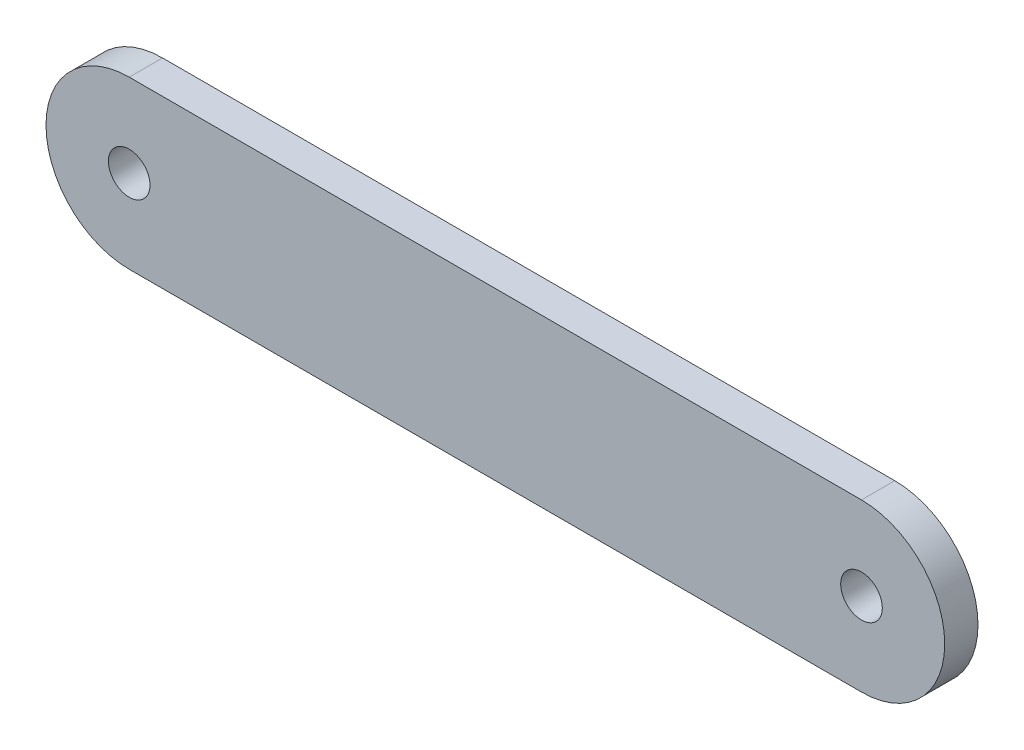
ISO-10303-21;
HEADER;
FILE_DESCRIPTION(('STEP AP214'),'2;1');
FILE_NAME('part.step','',(''),(''),'','','');
FILE_SCHEMA(('AUTOMOTIVE_DESIGN { 1 0 10303 214 1 1 1 1 }'));
ENDSEC;
DATA;
#1=APPLICATION_CONTEXT('core data for automotive mechanical design processes');
#2=APPLICATION_PROTOCOL_DEFINITION('international standard','automotive_design',2000,#1);
#3=PRODUCT_CONTEXT('',#1,'mechanical');
#4=PRODUCT('Part','Part','',(#3));
#5=PRODUCT_RELATED_PRODUCT_CATEGORY('part','',(#4));
#6=PRODUCT_DEFINITION_FORMATION('','',#4);
#7=PRODUCT_DEFINITION_CONTEXT('part definition',#1,'design');
#8=PRODUCT_DEFINITION('design','',#6,#7);
#9=PRODUCT_DEFINITION_SHAPE('','',#8);
#10=(LENGTH_UNIT() NAMED_UNIT(*) SI_UNIT(.MILLI.,.METRE.));
#11=(NAMED_UNIT(*) PLANE_ANGLE_UNIT() SI_UNIT($,.RADIAN.));
#12=(NAMED_UNIT(*) SI_UNIT($,.STERADIAN.) SOLID_ANGLE_UNIT());
#13=UNCERTAINTY_MEASURE_WITH_UNIT(LENGTH_MEASURE(1.E-05),#10,'distance_accuracy_value','');
#14=(GEOMETRIC_REPRESENTATION_CONTEXT(3) GLOBAL_UNCERTAINTY_ASSIGNED_CONTEXT((#13)) GLOBAL_UNIT_ASSIGNED_CONTEXT((#10,
#11,#12)) REPRESENTATION_CONTEXT('',''));
#15=CARTESIAN_POINT('',(0.,0.,0.));
#16=DIRECTION('',(0.,0.,1.));
#17=DIRECTION('',(1.,0.,0.));
#18=AXIS2_PLACEMENT_3D('',#15,#16,#17);
#19=CARTESIAN_POINT('',(0.,0.,2.));
#20=DIRECTION('',(0.,0.,1.));
#21=DIRECTION('',(1.,0.,0.));
#22=AXIS2_PLACEMENT_3D('',#19,#20,#21);
#23=PLANE('',#22);
#24=CARTESIAN_POINT('',(0.,0.,2.));
#25=DIRECTION('',(0.,0.,1.));
#26=DIRECTION('',(1.,0.,0.));
#27=AXIS2_PLACEMENT_3D('',#24,#25,#26);
#28=CIRCLE('',#27,1.25);
#29=CARTESIAN_POINT('',(1.25,0.,2.));
#30=VERTEX_POINT('',#29);
#31=EDGE_CURVE('E104',#30,#30,#28,.T.);
#32=ORIENTED_EDGE('',*,*,#31,.F.);
#33=EDGE_LOOP('',(#32));
#34=FACE_BOUND('',#33,.T.);
#35=CARTESIAN_POINT('',(0.,0.,2.));
#36=DIRECTION('',(0.,0.,1.));
#37=DIRECTION('',(1.,0.,0.));
#38=AXIS2_PLACEMENT_3D('',#35,#36,#37);
#39=CIRCLE('',#38,5.);
#40=CARTESIAN_POINT('',(0.,5.,2.));
#41=VERTEX_POINT('',#40);
#42=CARTESIAN_POINT('',(0.,-5.,2.));
#43=VERTEX_POINT('',#42);
#44=EDGE_CURVE('E89',#41,#43,#39,.T.);
#45=ORIENTED_EDGE('',*,*,#44,.T.);
#46=DIRECTION('',(1.,0.,0.));
#47=VECTOR('',#46,1.);
#48=CARTESIAN_POINT('',(0.,-5.,2.));
#49=LINE('',#48,#47);
#50=CARTESIAN_POINT('',(44.,-5.,2.));
#51=VERTEX_POINT('',#50);
#52=EDGE_CURVE('E84',#43,#51,#49,.T.);
#53=ORIENTED_EDGE('',*,*,#52,.T.);
#54=CARTESIAN_POINT('',(44.,0.,2.));
#55=DIRECTION('',(0.,0.,1.));
#56=DIRECTION('',(1.,0.,0.));
#57=AXIS2_PLACEMENT_3D('',#54,#55,#56);
#58=CIRCLE('',#57,5.);
#59=CARTESIAN_POINT('',(44.,5.,2.));
#60=VERTEX_POINT('',#59);
#61=EDGE_CURVE('E87',#51,#60,#58,.T.);
#62=ORIENTED_EDGE('',*,*,#61,.T.);
#63=DIRECTION('',(-1.,0.,0.));
#64=VECTOR('',#63,1.);
#65=CARTESIAN_POINT('',(0.,5.,2.));
#66=LINE('',#65,#64);
#67=EDGE_CURVE('E54',#60,#41,#66,.T.);
#68=ORIENTED_EDGE('',*,*,#67,.T.);
#69=EDGE_LOOP('',(#45,#53,#62,#68));
#70=FACE_BOUND('',#69,.T.);
#71=CARTESIAN_POINT('',(44.,0.,2.));
#72=DIRECTION('',(0.,0.,1.));
#73=DIRECTION('',(1.,0.,0.));
#74=AXIS2_PLACEMENT_3D('',#71,#72,#73);
#75=CIRCLE('',#74,1.25);
#76=CARTESIAN_POINT('',(45.25,0.,2.));
#77=VERTEX_POINT('',#76);
#78=EDGE_CURVE('E119',#77,#77,#75,.T.);
#79=ORIENTED_EDGE('',*,*,#78,.F.);
#80=EDGE_LOOP('',(#79));
#81=FACE_BOUND('',#80,.T.);
#82=ADVANCED_FACE('F37',(#34,#70,#81),#23,.T.);
#83=CARTESIAN_POINT('',(0.,0.,0.));
#84=DIRECTION('',(0.,0.,1.));
#85=DIRECTION('',(1.,0.,0.));
#86=AXIS2_PLACEMENT_3D('',#83,#84,#85);
#87=PLANE('',#86);
#88=CARTESIAN_POINT('',(0.,0.,0.));
#89=DIRECTION('',(0.,0.,1.));
#90=DIRECTION('',(1.,0.,0.));
#91=AXIS2_PLACEMENT_3D('',#88,#89,#90);
#92=CIRCLE('',#91,5.);
#93=CARTESIAN_POINT('',(0.,5.,0.));
#94=VERTEX_POINT('',#93);
#95=CARTESIAN_POINT('',(0.,-5.,0.));
#96=VERTEX_POINT('',#95);
#97=EDGE_CURVE('E101',#94,#96,#92,.T.);
#98=ORIENTED_EDGE('',*,*,#97,.F.);
#99=DIRECTION('',(-1.,0.,0.));
#100=VECTOR('',#99,1.);
#101=CARTESIAN_POINT('',(0.,5.,0.));
#102=LINE('',#101,#100);
#103=CARTESIAN_POINT('',(44.,5.,0.));
#104=VERTEX_POINT('',#103);
#105=EDGE_CURVE('E77',#104,#94,#102,.T.);
#106=ORIENTED_EDGE('',*,*,#105,.F.);
#107=CARTESIAN_POINT('',(44.,0.,0.));
#108=DIRECTION('',(0.,0.,1.));
#109=DIRECTION('',(1.,0.,0.));
#110=AXIS2_PLACEMENT_3D('',#107,#108,#109);
#111=CIRCLE('',#110,5.);
#112=CARTESIAN_POINT('',(44.,-5.,0.));
#113=VERTEX_POINT('',#112);
#114=EDGE_CURVE('E71',#113,#104,#111,.T.);
#115=ORIENTED_EDGE('',*,*,#114,.F.);
#116=DIRECTION('',(1.,0.,0.));
#117=VECTOR('',#116,1.);
#118=CARTESIAN_POINT('',(0.,-5.,0.));
#119=LINE('',#118,#117);
#120=EDGE_CURVE('E93',#96,#113,#119,.T.);
#121=ORIENTED_EDGE('',*,*,#120,.F.);
#122=EDGE_LOOP('',(#98,#106,#115,#121));
#123=FACE_BOUND('',#122,.T.);
#124=CARTESIAN_POINT('',(0.,0.,0.));
#125=DIRECTION('',(0.,0.,1.));
#126=DIRECTION('',(1.,0.,0.));
#127=AXIS2_PLACEMENT_3D('',#124,#125,#126);
#128=CIRCLE('',#127,1.25);
#129=CARTESIAN_POINT('',(1.25,0.,0.));
#130=VERTEX_POINT('',#129);
#131=EDGE_CURVE('E116',#130,#130,#128,.T.);
#132=ORIENTED_EDGE('',*,*,#131,.T.);
#133=EDGE_LOOP('',(#132));
#134=FACE_BOUND('',#133,.T.);
#135=CARTESIAN_POINT('',(44.,0.,0.));
#136=DIRECTION('',(0.,0.,1.));
#137=DIRECTION('',(1.,0.,0.));
#138=AXIS2_PLACEMENT_3D('',#135,#136,#137);
#139=CIRCLE('',#138,1.25);
#140=CARTESIAN_POINT('',(45.25,0.,0.));
#141=VERTEX_POINT('',#140);
#142=EDGE_CURVE('E122',#141,#141,#139,.T.);
#143=ORIENTED_EDGE('',*,*,#142,.T.);
#144=EDGE_LOOP('',(#143));
#145=FACE_BOUND('',#144,.T.);
#146=ADVANCED_FACE('F112',(#123,#134,#145),#87,.F.);
#147=CARTESIAN_POINT('',(0.,0.,2.));
#148=DIRECTION('',(0.,0.,-1.));
#149=DIRECTION('',(-1.,0.,0.));
#150=AXIS2_PLACEMENT_3D('',#147,#148,#149);
#151=CYLINDRICAL_SURFACE('',#150,5.);
#152=ORIENTED_EDGE('',*,*,#97,.T.);
#153=DIRECTION('',(0.,0.,-1.));
#154=VECTOR('',#153,1.);
#155=CARTESIAN_POINT('',(0.,-5.,2.));
#156=LINE('',#155,#154);
#157=EDGE_CURVE('E11',#43,#96,#156,.T.);
#158=ORIENTED_EDGE('',*,*,#157,.F.);
#159=ORIENTED_EDGE('',*,*,#44,.F.);
#160=DIRECTION('',(0.,0.,-1.));
#161=VECTOR('',#160,1.);
#162=CARTESIAN_POINT('',(0.,5.,2.));
#163=LINE('',#162,#161);
#164=EDGE_CURVE('E97',#41,#94,#163,.T.);
#165=ORIENTED_EDGE('',*,*,#164,.T.);
#166=EDGE_LOOP('',(#152,#158,#159,#165));
#167=FACE_BOUND('',#166,.T.);
#168=ADVANCED_FACE('F39',(#167),#151,.T.);
#169=CARTESIAN_POINT('',(0.,-5.,2.));
#170=DIRECTION('',(0.,1.,0.));
#171=DIRECTION('',(0.,0.,1.));
#172=AXIS2_PLACEMENT_3D('',#169,#170,#171);
#173=PLANE('',#172);
#174=ORIENTED_EDGE('',*,*,#120,.T.);
#175=DIRECTION('',(0.,0.,-1.));
#176=VECTOR('',#175,1.);
#177=CARTESIAN_POINT('',(44.,-5.,2.));
#178=LINE('',#177,#176);
#179=EDGE_CURVE('E46',#51,#113,#178,.T.);
#180=ORIENTED_EDGE('',*,*,#179,.F.);
#181=ORIENTED_EDGE('',*,*,#52,.F.);
#182=ORIENTED_EDGE('',*,*,#157,.T.);
#183=EDGE_LOOP('',(#174,#180,#181,#182));
#184=FACE_BOUND('',#183,.T.);
#185=ADVANCED_FACE('F92',(#184),#173,.F.);
#186=CARTESIAN_POINT('',(44.,0.,2.));
#187=DIRECTION('',(0.,0.,-1.));
#188=DIRECTION('',(-1.,0.,0.));
#189=AXIS2_PLACEMENT_3D('',#186,#187,#188);
#190=CYLINDRICAL_SURFACE('',#189,5.);
#191=ORIENTED_EDGE('',*,*,#114,.T.);
#192=DIRECTION('',(0.,0.,-1.));
#193=VECTOR('',#192,1.);
#194=CARTESIAN_POINT('',(44.,5.,2.));
#195=LINE('',#194,#193);
#196=EDGE_CURVE('E94',#60,#104,#195,.T.);
#197=ORIENTED_EDGE('',*,*,#196,.F.);
#198=ORIENTED_EDGE('',*,*,#61,.F.);
#199=ORIENTED_EDGE('',*,*,#179,.T.);
#200=EDGE_LOOP('',(#191,#197,#198,#199));
#201=FACE_BOUND('',#200,.T.);
#202=ADVANCED_FACE('F95',(#201),#190,.T.);
#203=CARTESIAN_POINT('',(0.,5.,2.));
#204=DIRECTION('',(0.,-1.,0.));
#205=DIRECTION('',(0.,0.,-1.));
#206=AXIS2_PLACEMENT_3D('',#203,#204,#205);
#207=PLANE('',#206);
#208=ORIENTED_EDGE('',*,*,#105,.T.);
#209=ORIENTED_EDGE('',*,*,#164,.F.);
#210=ORIENTED_EDGE('',*,*,#67,.F.);
#211=ORIENTED_EDGE('',*,*,#196,.T.);
#212=EDGE_LOOP('',(#208,#209,#210,#211));
#213=FACE_BOUND('',#212,.T.);
#214=ADVANCED_FACE('F109',(#213),#207,.F.);
#215=CARTESIAN_POINT('',(0.,0.,2.));
#216=DIRECTION('',(0.,0.,-1.));
#217=DIRECTION('',(-1.,0.,0.));
#218=AXIS2_PLACEMENT_3D('',#215,#216,#217);
#219=CYLINDRICAL_SURFACE('',#218,1.25);
#220=ORIENTED_EDGE('',*,*,#31,.T.);
#221=EDGE_LOOP('',(#220));
#222=FACE_BOUND('',#221,.T.);
#223=ORIENTED_EDGE('',*,*,#131,.F.);
#224=EDGE_LOOP('',(#223));
#225=FACE_BOUND('',#224,.T.);
#226=ADVANCED_FACE('F139',(#222,#225),#219,.F.);
#227=CARTESIAN_POINT('',(44.,0.,2.));
#228=DIRECTION('',(0.,0.,-1.));
#229=DIRECTION('',(-1.,0.,0.));
#230=AXIS2_PLACEMENT_3D('',#227,#228,#229);
#231=CYLINDRICAL_SURFACE('',#230,1.25);
#232=ORIENTED_EDGE('',*,*,#78,.T.);
#233=EDGE_LOOP('',(#232));
#234=FACE_BOUND('',#233,.T.);
#235=ORIENTED_EDGE('',*,*,#142,.F.);
#236=EDGE_LOOP('',(#235));
#237=FACE_BOUND('',#236,.T.);
#238=ADVANCED_FACE('F128',(#234,#237),#231,.F.);
#239=CLOSED_SHELL('',(#82,#146,#168,#185,#202,#214,#226,#238));
#240=MANIFOLD_SOLID_BREP('B2',#239);
#241=ADVANCED_BREP_SHAPE_REPRESENTATION('',(#18,#240),#14);
#242=SHAPE_DEFINITION_REPRESENTATION(#9,#241);
ENDSEC;
END-ISO-10303-21;
